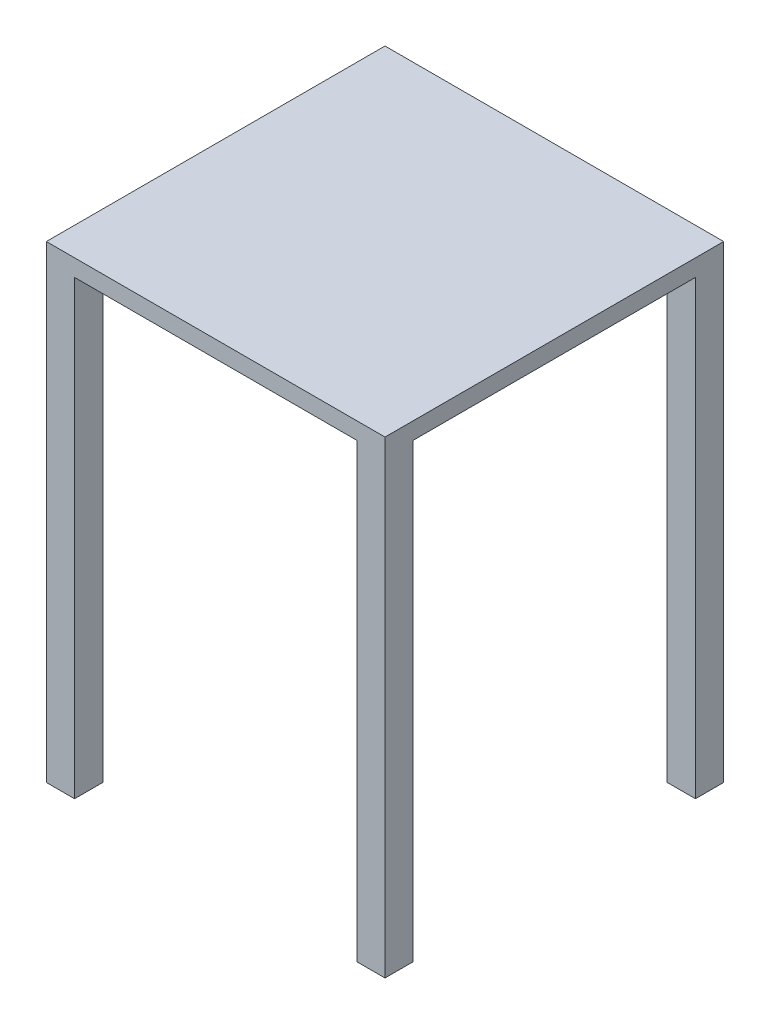
ISO-10303-21;
HEADER;
FILE_DESCRIPTION(('STEP AP214'),'2;1');
FILE_NAME('part.step','',(''),(''),'','','');
FILE_SCHEMA(('AUTOMOTIVE_DESIGN { 1 0 10303 214 1 1 1 1 }'));
ENDSEC;
DATA;
#1=APPLICATION_CONTEXT('core data for automotive mechanical design processes');
#2=APPLICATION_PROTOCOL_DEFINITION('international standard','automotive_design',2000,#1);
#3=PRODUCT_CONTEXT('',#1,'mechanical');
#4=PRODUCT('Part','Part','',(#3));
#5=PRODUCT_RELATED_PRODUCT_CATEGORY('part','',(#4));
#6=PRODUCT_DEFINITION_FORMATION('','',#4);
#7=PRODUCT_DEFINITION_CONTEXT('part definition',#1,'design');
#8=PRODUCT_DEFINITION('design','',#6,#7);
#9=PRODUCT_DEFINITION_SHAPE('','',#8);
#10=(LENGTH_UNIT() NAMED_UNIT(*) SI_UNIT(.MILLI.,.METRE.));
#11=(NAMED_UNIT(*) PLANE_ANGLE_UNIT() SI_UNIT($,.RADIAN.));
#12=(NAMED_UNIT(*) SI_UNIT($,.STERADIAN.) SOLID_ANGLE_UNIT());
#13=UNCERTAINTY_MEASURE_WITH_UNIT(LENGTH_MEASURE(1.E-05),#10,'distance_accuracy_value','');
#14=(GEOMETRIC_REPRESENTATION_CONTEXT(3) GLOBAL_UNCERTAINTY_ASSIGNED_CONTEXT((#13)) GLOBAL_UNIT_ASSIGNED_CONTEXT((#10,
#11,#12)) REPRESENTATION_CONTEXT('',''));
#15=CARTESIAN_POINT('',(0.,0.,0.));
#16=DIRECTION('',(0.,0.,1.));
#17=DIRECTION('',(1.,0.,0.));
#18=AXIS2_PLACEMENT_3D('',#15,#16,#17);
#19=CARTESIAN_POINT('',(0.,0.,0.));
#20=DIRECTION('',(0.,1.,0.));
#21=DIRECTION('',(0.,0.,1.));
#22=AXIS2_PLACEMENT_3D('',#19,#20,#21);
#23=PLANE('',#22);
#24=DIRECTION('',(0.,0.,1.));
#25=VECTOR('',#24,1.);
#26=CARTESIAN_POINT('',(-250.,0.,-300.));
#27=LINE('',#26,#25);
#28=CARTESIAN_POINT('',(-250.,0.,-300.));
#29=VERTEX_POINT('',#28);
#30=CARTESIAN_POINT('',(-250.,0.,-250.));
#31=VERTEX_POINT('',#30);
#32=EDGE_CURVE('E474',#29,#31,#27,.T.);
#33=ORIENTED_EDGE('',*,*,#32,.F.);
#34=DIRECTION('',(-1.,0.,0.));
#35=VECTOR('',#34,1.);
#36=CARTESIAN_POINT('',(300.,0.,-300.));
#37=LINE('',#36,#35);
#38=CARTESIAN_POINT('',(250.,0.,-300.));
#39=VERTEX_POINT('',#38);
#40=EDGE_CURVE('E180',#39,#29,#37,.T.);
#41=ORIENTED_EDGE('',*,*,#40,.F.);
#42=DIRECTION('',(0.,0.,-1.));
#43=VECTOR('',#42,1.);
#44=CARTESIAN_POINT('',(250.,0.,-300.));
#45=LINE('',#44,#43);
#46=CARTESIAN_POINT('',(250.,0.,-250.));
#47=VERTEX_POINT('',#46);
#48=EDGE_CURVE('E186',#47,#39,#45,.T.);
#49=ORIENTED_EDGE('',*,*,#48,.F.);
#50=DIRECTION('',(-1.,0.,0.));
#51=VECTOR('',#50,1.);
#52=CARTESIAN_POINT('',(300.,0.,-250.));
#53=LINE('',#52,#51);
#54=CARTESIAN_POINT('',(300.,0.,-250.));
#55=VERTEX_POINT('',#54);
#56=EDGE_CURVE('E182',#55,#47,#53,.T.);
#57=ORIENTED_EDGE('',*,*,#56,.F.);
#58=DIRECTION('',(0.,0.,-1.));
#59=VECTOR('',#58,1.);
#60=CARTESIAN_POINT('',(300.,0.,300.));
#61=LINE('',#60,#59);
#62=CARTESIAN_POINT('',(300.,0.,250.));
#63=VERTEX_POINT('',#62);
#64=EDGE_CURVE('E301',#63,#55,#61,.T.);
#65=ORIENTED_EDGE('',*,*,#64,.F.);
#66=DIRECTION('',(1.,0.,0.));
#67=VECTOR('',#66,1.);
#68=CARTESIAN_POINT('',(300.,0.,250.));
#69=LINE('',#68,#67);
#70=CARTESIAN_POINT('',(250.,0.,250.));
#71=VERTEX_POINT('',#70);
#72=EDGE_CURVE('E223',#71,#63,#69,.T.);
#73=ORIENTED_EDGE('',*,*,#72,.F.);
#74=DIRECTION('',(0.,0.,-1.));
#75=VECTOR('',#74,1.);
#76=CARTESIAN_POINT('',(250.,0.,300.));
#77=LINE('',#76,#75);
#78=CARTESIAN_POINT('',(250.,0.,300.));
#79=VERTEX_POINT('',#78);
#80=EDGE_CURVE('E217',#79,#71,#77,.T.);
#81=ORIENTED_EDGE('',*,*,#80,.F.);
#82=DIRECTION('',(1.,0.,0.));
#83=VECTOR('',#82,1.);
#84=CARTESIAN_POINT('',(300.,0.,300.));
#85=LINE('',#84,#83);
#86=CARTESIAN_POINT('',(-250.,0.,300.));
#87=VERTEX_POINT('',#86);
#88=EDGE_CURVE('E297',#87,#79,#85,.T.);
#89=ORIENTED_EDGE('',*,*,#88,.F.);
#90=DIRECTION('',(0.,0.,1.));
#91=VECTOR('',#90,1.);
#92=CARTESIAN_POINT('',(-250.,0.,300.));
#93=LINE('',#92,#91);
#94=CARTESIAN_POINT('',(-250.,0.,250.));
#95=VERTEX_POINT('',#94);
#96=EDGE_CURVE('E252',#95,#87,#93,.T.);
#97=ORIENTED_EDGE('',*,*,#96,.F.);
#98=DIRECTION('',(1.,0.,0.));
#99=VECTOR('',#98,1.);
#100=CARTESIAN_POINT('',(-300.,0.,250.));
#101=LINE('',#100,#99);
#102=CARTESIAN_POINT('',(-300.,0.,250.));
#103=VERTEX_POINT('',#102);
#104=EDGE_CURVE('E246',#103,#95,#101,.T.);
#105=ORIENTED_EDGE('',*,*,#104,.F.);
#106=DIRECTION('',(0.,0.,1.));
#107=VECTOR('',#106,1.);
#108=CARTESIAN_POINT('',(-300.,0.,300.));
#109=LINE('',#108,#107);
#110=CARTESIAN_POINT('',(-300.,0.,-250.));
#111=VERTEX_POINT('',#110);
#112=EDGE_CURVE('E280',#111,#103,#109,.T.);
#113=ORIENTED_EDGE('',*,*,#112,.F.);
#114=DIRECTION('',(-1.,0.,0.));
#115=VECTOR('',#114,1.);
#116=CARTESIAN_POINT('',(-300.,0.,-250.));
#117=LINE('',#116,#115);
#118=EDGE_CURVE('E176',#31,#111,#117,.T.);
#119=ORIENTED_EDGE('',*,*,#118,.F.);
#120=EDGE_LOOP('',(#33,#41,#49,#57,#65,#73,#81,#89,#97,#105,#113,#119));
#121=FACE_BOUND('',#120,.T.);
#122=ADVANCED_FACE('F39',(#121),#23,.F.);
#123=CARTESIAN_POINT('',(-300.,30.,300.));
#124=DIRECTION('',(1.,0.,0.));
#125=DIRECTION('',(0.,0.,-1.));
#126=AXIS2_PLACEMENT_3D('',#123,#124,#125);
#127=PLANE('',#126);
#128=DIRECTION('',(0.,-1.,0.));
#129=VECTOR('',#128,1.);
#130=CARTESIAN_POINT('',(-300.,30.,-300.));
#131=LINE('',#130,#129);
#132=CARTESIAN_POINT('',(-300.,30.,-300.));
#133=VERTEX_POINT('',#132);
#134=CARTESIAN_POINT('',(-300.,-800.,-300.));
#135=VERTEX_POINT('',#134);
#136=EDGE_CURVE('E294',#133,#135,#131,.T.);
#137=ORIENTED_EDGE('',*,*,#136,.T.);
#138=DIRECTION('',(0.,0.,-1.));
#139=VECTOR('',#138,1.);
#140=CARTESIAN_POINT('',(-300.,-800.,-300.));
#141=LINE('',#140,#139);
#142=CARTESIAN_POINT('',(-300.,-800.,-250.));
#143=VERTEX_POINT('',#142);
#144=EDGE_CURVE('E173',#143,#135,#141,.T.);
#145=ORIENTED_EDGE('',*,*,#144,.F.);
#146=DIRECTION('',(0.,1.,0.));
#147=VECTOR('',#146,1.);
#148=CARTESIAN_POINT('',(-300.,-800.,-250.));
#149=LINE('',#148,#147);
#150=EDGE_CURVE('E188',#143,#111,#149,.T.);
#151=ORIENTED_EDGE('',*,*,#150,.T.);
#152=ORIENTED_EDGE('',*,*,#112,.T.);
#153=DIRECTION('',(0.,1.,0.));
#154=VECTOR('',#153,1.);
#155=CARTESIAN_POINT('',(-300.,-800.,250.));
#156=LINE('',#155,#154);
#157=CARTESIAN_POINT('',(-300.,-800.,250.));
#158=VERTEX_POINT('',#157);
#159=EDGE_CURVE('E276',#158,#103,#156,.T.);
#160=ORIENTED_EDGE('',*,*,#159,.F.);
#161=DIRECTION('',(0.,0.,-1.));
#162=VECTOR('',#161,1.);
#163=CARTESIAN_POINT('',(-300.,-800.,300.));
#164=LINE('',#163,#162);
#165=CARTESIAN_POINT('',(-300.,-800.,300.));
#166=VERTEX_POINT('',#165);
#167=EDGE_CURVE('E247',#166,#158,#164,.T.);
#168=ORIENTED_EDGE('',*,*,#167,.F.);
#169=DIRECTION('',(0.,-1.,0.));
#170=VECTOR('',#169,1.);
#171=CARTESIAN_POINT('',(-300.,30.,300.));
#172=LINE('',#171,#170);
#173=CARTESIAN_POINT('',(-300.,30.,300.));
#174=VERTEX_POINT('',#173);
#175=EDGE_CURVE('E11',#174,#166,#172,.T.);
#176=ORIENTED_EDGE('',*,*,#175,.F.);
#177=DIRECTION('',(0.,0.,1.));
#178=VECTOR('',#177,1.);
#179=CARTESIAN_POINT('',(-300.,30.,300.));
#180=LINE('',#179,#178);
#181=EDGE_CURVE('E281',#133,#174,#180,.T.);
#182=ORIENTED_EDGE('',*,*,#181,.F.);
#183=EDGE_LOOP('',(#137,#145,#151,#152,#160,#168,#176,#182));
#184=FACE_BOUND('',#183,.T.);
#185=ADVANCED_FACE('F41',(#184),#127,.F.);
#186=CARTESIAN_POINT('',(300.,30.,300.));
#187=DIRECTION('',(0.,0.,-1.));
#188=DIRECTION('',(-1.,0.,0.));
#189=AXIS2_PLACEMENT_3D('',#186,#187,#188);
#190=PLANE('',#189);
#191=ORIENTED_EDGE('',*,*,#175,.T.);
#192=DIRECTION('',(-1.,0.,0.));
#193=VECTOR('',#192,1.);
#194=CARTESIAN_POINT('',(-300.,-800.,300.));
#195=LINE('',#194,#193);
#196=CARTESIAN_POINT('',(-250.,-800.,300.));
#197=VERTEX_POINT('',#196);
#198=EDGE_CURVE('E258',#197,#166,#195,.T.);
#199=ORIENTED_EDGE('',*,*,#198,.F.);
#200=DIRECTION('',(0.,1.,0.));
#201=VECTOR('',#200,1.);
#202=CARTESIAN_POINT('',(-250.,-800.,300.));
#203=LINE('',#202,#201);
#204=EDGE_CURVE('E262',#197,#87,#203,.T.);
#205=ORIENTED_EDGE('',*,*,#204,.T.);
#206=ORIENTED_EDGE('',*,*,#88,.T.);
#207=DIRECTION('',(0.,1.,0.));
#208=VECTOR('',#207,1.);
#209=CARTESIAN_POINT('',(250.,-800.,300.));
#210=LINE('',#209,#208);
#211=CARTESIAN_POINT('',(250.,-800.,300.));
#212=VERTEX_POINT('',#211);
#213=EDGE_CURVE('E243',#212,#79,#210,.T.);
#214=ORIENTED_EDGE('',*,*,#213,.F.);
#215=DIRECTION('',(-1.,0.,0.));
#216=VECTOR('',#215,1.);
#217=CARTESIAN_POINT('',(300.,-800.,300.));
#218=LINE('',#217,#216);
#219=CARTESIAN_POINT('',(300.,-800.,300.));
#220=VERTEX_POINT('',#219);
#221=EDGE_CURVE('E218',#220,#212,#218,.T.);
#222=ORIENTED_EDGE('',*,*,#221,.F.);
#223=DIRECTION('',(0.,-1.,0.));
#224=VECTOR('',#223,1.);
#225=CARTESIAN_POINT('',(300.,30.,300.));
#226=LINE('',#225,#224);
#227=CARTESIAN_POINT('',(300.,30.,300.));
#228=VERTEX_POINT('',#227);
#229=EDGE_CURVE('E48',#228,#220,#226,.T.);
#230=ORIENTED_EDGE('',*,*,#229,.F.);
#231=DIRECTION('',(1.,0.,0.));
#232=VECTOR('',#231,1.);
#233=CARTESIAN_POINT('',(300.,30.,300.));
#234=LINE('',#233,#232);
#235=EDGE_CURVE('E285',#174,#228,#234,.T.);
#236=ORIENTED_EDGE('',*,*,#235,.F.);
#237=EDGE_LOOP('',(#191,#199,#205,#206,#214,#222,#230,#236));
#238=FACE_BOUND('',#237,.T.);
#239=ADVANCED_FACE('F321',(#238),#190,.F.);
#240=CARTESIAN_POINT('',(300.,30.,300.));
#241=DIRECTION('',(-1.,0.,0.));
#242=DIRECTION('',(0.,0.,1.));
#243=AXIS2_PLACEMENT_3D('',#240,#241,#242);
#244=PLANE('',#243);
#245=ORIENTED_EDGE('',*,*,#229,.T.);
#246=DIRECTION('',(0.,0.,1.));
#247=VECTOR('',#246,1.);
#248=CARTESIAN_POINT('',(300.,-800.,300.));
#249=LINE('',#248,#247);
#250=CARTESIAN_POINT('',(300.,-800.,250.));
#251=VERTEX_POINT('',#250);
#252=EDGE_CURVE('E229',#251,#220,#249,.T.);
#253=ORIENTED_EDGE('',*,*,#252,.F.);
#254=DIRECTION('',(0.,1.,0.));
#255=VECTOR('',#254,1.);
#256=CARTESIAN_POINT('',(300.,-800.,250.));
#257=LINE('',#256,#255);
#258=EDGE_CURVE('E63',#251,#63,#257,.T.);
#259=ORIENTED_EDGE('',*,*,#258,.T.);
#260=ORIENTED_EDGE('',*,*,#64,.T.);
#261=DIRECTION('',(0.,1.,0.));
#262=VECTOR('',#261,1.);
#263=CARTESIAN_POINT('',(300.,-800.,-250.));
#264=LINE('',#263,#262);
#265=CARTESIAN_POINT('',(300.,-800.,-250.));
#266=VERTEX_POINT('',#265);
#267=EDGE_CURVE('E214',#266,#55,#264,.T.);
#268=ORIENTED_EDGE('',*,*,#267,.F.);
#269=DIRECTION('',(0.,0.,1.));
#270=VECTOR('',#269,1.);
#271=CARTESIAN_POINT('',(300.,-800.,-300.));
#272=LINE('',#271,#270);
#273=CARTESIAN_POINT('',(300.,-800.,-300.));
#274=VERTEX_POINT('',#273);
#275=EDGE_CURVE('E192',#274,#266,#272,.T.);
#276=ORIENTED_EDGE('',*,*,#275,.F.);
#277=DIRECTION('',(0.,-1.,0.));
#278=VECTOR('',#277,1.);
#279=CARTESIAN_POINT('',(300.,30.,-300.));
#280=LINE('',#279,#278);
#281=CARTESIAN_POINT('',(300.,30.,-300.));
#282=VERTEX_POINT('',#281);
#283=EDGE_CURVE('E308',#282,#274,#280,.T.);
#284=ORIENTED_EDGE('',*,*,#283,.F.);
#285=DIRECTION('',(0.,0.,-1.));
#286=VECTOR('',#285,1.);
#287=CARTESIAN_POINT('',(300.,30.,300.));
#288=LINE('',#287,#286);
#289=EDGE_CURVE('E288',#228,#282,#288,.T.);
#290=ORIENTED_EDGE('',*,*,#289,.F.);
#291=EDGE_LOOP('',(#245,#253,#259,#260,#268,#276,#284,#290));
#292=FACE_BOUND('',#291,.T.);
#293=ADVANCED_FACE('F313',(#292),#244,.F.);
#294=CARTESIAN_POINT('',(300.,30.,-300.));
#295=DIRECTION('',(0.,0.,1.));
#296=DIRECTION('',(1.,0.,0.));
#297=AXIS2_PLACEMENT_3D('',#294,#295,#296);
#298=PLANE('',#297);
#299=ORIENTED_EDGE('',*,*,#283,.T.);
#300=DIRECTION('',(1.,0.,0.));
#301=VECTOR('',#300,1.);
#302=CARTESIAN_POINT('',(300.,-800.,-300.));
#303=LINE('',#302,#301);
#304=CARTESIAN_POINT('',(250.,-800.,-300.));
#305=VERTEX_POINT('',#304);
#306=EDGE_CURVE('E202',#305,#274,#303,.T.);
#307=ORIENTED_EDGE('',*,*,#306,.F.);
#308=DIRECTION('',(0.,1.,0.));
#309=VECTOR('',#308,1.);
#310=CARTESIAN_POINT('',(250.,-800.,-300.));
#311=LINE('',#310,#309);
#312=EDGE_CURVE('E55',#305,#39,#311,.T.);
#313=ORIENTED_EDGE('',*,*,#312,.T.);
#314=ORIENTED_EDGE('',*,*,#40,.T.);
#315=DIRECTION('',(0.,1.,0.));
#316=VECTOR('',#315,1.);
#317=CARTESIAN_POINT('',(-250.,-800.,-300.));
#318=LINE('',#317,#316);
#319=CARTESIAN_POINT('',(-250.,-800.,-300.));
#320=VERTEX_POINT('',#319);
#321=EDGE_CURVE('E159',#320,#29,#318,.T.);
#322=ORIENTED_EDGE('',*,*,#321,.F.);
#323=DIRECTION('',(1.,0.,0.));
#324=VECTOR('',#323,1.);
#325=CARTESIAN_POINT('',(-300.,-800.,-300.));
#326=LINE('',#325,#324);
#327=EDGE_CURVE('E167',#135,#320,#326,.T.);
#328=ORIENTED_EDGE('',*,*,#327,.F.);
#329=ORIENTED_EDGE('',*,*,#136,.F.);
#330=DIRECTION('',(-1.,0.,0.));
#331=VECTOR('',#330,1.);
#332=CARTESIAN_POINT('',(300.,30.,-300.));
#333=LINE('',#332,#331);
#334=EDGE_CURVE('E291',#282,#133,#333,.T.);
#335=ORIENTED_EDGE('',*,*,#334,.F.);
#336=EDGE_LOOP('',(#299,#307,#313,#314,#322,#328,#329,#335));
#337=FACE_BOUND('',#336,.T.);
#338=ADVANCED_FACE('F178',(#337),#298,.F.);
#339=CARTESIAN_POINT('',(0.,30.,0.));
#340=DIRECTION('',(0.,1.,0.));
#341=DIRECTION('',(0.,0.,1.));
#342=AXIS2_PLACEMENT_3D('',#339,#340,#341);
#343=PLANE('',#342);
#344=ORIENTED_EDGE('',*,*,#181,.T.);
#345=ORIENTED_EDGE('',*,*,#235,.T.);
#346=ORIENTED_EDGE('',*,*,#289,.T.);
#347=ORIENTED_EDGE('',*,*,#334,.T.);
#348=EDGE_LOOP('',(#344,#345,#346,#347));
#349=FACE_BOUND('',#348,.T.);
#350=ADVANCED_FACE('F350',(#349),#343,.T.);
#351=CARTESIAN_POINT('',(-300.,-800.,250.));
#352=DIRECTION('',(0.,0.,1.));
#353=DIRECTION('',(1.,0.,0.));
#354=AXIS2_PLACEMENT_3D('',#351,#352,#353);
#355=PLANE('',#354);
#356=ORIENTED_EDGE('',*,*,#104,.T.);
#357=DIRECTION('',(0.,1.,0.));
#358=VECTOR('',#357,1.);
#359=CARTESIAN_POINT('',(-250.,-800.,250.));
#360=LINE('',#359,#358);
#361=CARTESIAN_POINT('',(-250.,-800.,250.));
#362=VERTEX_POINT('',#361);
#363=EDGE_CURVE('E272',#362,#95,#360,.T.);
#364=ORIENTED_EDGE('',*,*,#363,.F.);
#365=DIRECTION('',(1.,0.,0.));
#366=VECTOR('',#365,1.);
#367=CARTESIAN_POINT('',(-300.,-800.,250.));
#368=LINE('',#367,#366);
#369=EDGE_CURVE('E251',#158,#362,#368,.T.);
#370=ORIENTED_EDGE('',*,*,#369,.F.);
#371=ORIENTED_EDGE('',*,*,#159,.T.);
#372=EDGE_LOOP('',(#356,#364,#370,#371));
#373=FACE_BOUND('',#372,.T.);
#374=ADVANCED_FACE('F375',(#373),#355,.F.);
#375=CARTESIAN_POINT('',(-250.,-800.,300.));
#376=DIRECTION('',(-1.,0.,0.));
#377=DIRECTION('',(0.,0.,1.));
#378=AXIS2_PLACEMENT_3D('',#375,#376,#377);
#379=PLANE('',#378);
#380=ORIENTED_EDGE('',*,*,#96,.T.);
#381=ORIENTED_EDGE('',*,*,#204,.F.);
#382=DIRECTION('',(0.,0.,1.));
#383=VECTOR('',#382,1.);
#384=CARTESIAN_POINT('',(-250.,-800.,300.));
#385=LINE('',#384,#383);
#386=EDGE_CURVE('E255',#362,#197,#385,.T.);
#387=ORIENTED_EDGE('',*,*,#386,.F.);
#388=ORIENTED_EDGE('',*,*,#363,.T.);
#389=EDGE_LOOP('',(#380,#381,#387,#388));
#390=FACE_BOUND('',#389,.T.);
#391=ADVANCED_FACE('F381',(#390),#379,.F.);
#392=CARTESIAN_POINT('',(0.,-800.,0.));
#393=DIRECTION('',(0.,-1.,0.));
#394=DIRECTION('',(0.,0.,-1.));
#395=AXIS2_PLACEMENT_3D('',#392,#393,#394);
#396=PLANE('',#395);
#397=ORIENTED_EDGE('',*,*,#167,.T.);
#398=ORIENTED_EDGE('',*,*,#369,.T.);
#399=ORIENTED_EDGE('',*,*,#386,.T.);
#400=ORIENTED_EDGE('',*,*,#198,.T.);
#401=EDGE_LOOP('',(#397,#398,#399,#400));
#402=FACE_BOUND('',#401,.T.);
#403=ADVANCED_FACE('F340',(#402),#396,.T.);
#404=CARTESIAN_POINT('',(250.,-800.,300.));
#405=DIRECTION('',(1.,0.,0.));
#406=DIRECTION('',(0.,0.,-1.));
#407=AXIS2_PLACEMENT_3D('',#404,#405,#406);
#408=PLANE('',#407);
#409=ORIENTED_EDGE('',*,*,#80,.T.);
#410=DIRECTION('',(0.,1.,0.));
#411=VECTOR('',#410,1.);
#412=CARTESIAN_POINT('',(250.,-800.,250.));
#413=LINE('',#412,#411);
#414=CARTESIAN_POINT('',(250.,-800.,250.));
#415=VERTEX_POINT('',#414);
#416=EDGE_CURVE('E239',#415,#71,#413,.T.);
#417=ORIENTED_EDGE('',*,*,#416,.F.);
#418=DIRECTION('',(0.,0.,-1.));
#419=VECTOR('',#418,1.);
#420=CARTESIAN_POINT('',(250.,-800.,300.));
#421=LINE('',#420,#419);
#422=EDGE_CURVE('E222',#212,#415,#421,.T.);
#423=ORIENTED_EDGE('',*,*,#422,.F.);
#424=ORIENTED_EDGE('',*,*,#213,.T.);
#425=EDGE_LOOP('',(#409,#417,#423,#424));
#426=FACE_BOUND('',#425,.T.);
#427=ADVANCED_FACE('F324',(#426),#408,.F.);
#428=CARTESIAN_POINT('',(300.,-800.,250.));
#429=DIRECTION('',(0.,0.,1.));
#430=DIRECTION('',(1.,0.,0.));
#431=AXIS2_PLACEMENT_3D('',#428,#429,#430);
#432=PLANE('',#431);
#433=ORIENTED_EDGE('',*,*,#72,.T.);
#434=ORIENTED_EDGE('',*,*,#258,.F.);
#435=DIRECTION('',(1.,0.,0.));
#436=VECTOR('',#435,1.);
#437=CARTESIAN_POINT('',(300.,-800.,250.));
#438=LINE('',#437,#436);
#439=EDGE_CURVE('E226',#415,#251,#438,.T.);
#440=ORIENTED_EDGE('',*,*,#439,.F.);
#441=ORIENTED_EDGE('',*,*,#416,.T.);
#442=EDGE_LOOP('',(#433,#434,#440,#441));
#443=FACE_BOUND('',#442,.T.);
#444=ADVANCED_FACE('F331',(#443),#432,.F.);
#445=CARTESIAN_POINT('',(0.,-800.,0.));
#446=DIRECTION('',(0.,-1.,0.));
#447=DIRECTION('',(0.,0.,-1.));
#448=AXIS2_PLACEMENT_3D('',#445,#446,#447);
#449=PLANE('',#448);
#450=ORIENTED_EDGE('',*,*,#221,.T.);
#451=ORIENTED_EDGE('',*,*,#422,.T.);
#452=ORIENTED_EDGE('',*,*,#439,.T.);
#453=ORIENTED_EDGE('',*,*,#252,.T.);
#454=EDGE_LOOP('',(#450,#451,#452,#453));
#455=FACE_BOUND('',#454,.T.);
#456=ADVANCED_FACE('F318',(#455),#449,.T.);
#457=CARTESIAN_POINT('',(300.,-800.,-250.));
#458=DIRECTION('',(0.,0.,-1.));
#459=DIRECTION('',(-1.,0.,0.));
#460=AXIS2_PLACEMENT_3D('',#457,#458,#459);
#461=PLANE('',#460);
#462=ORIENTED_EDGE('',*,*,#56,.T.);
#463=DIRECTION('',(0.,1.,0.));
#464=VECTOR('',#463,1.);
#465=CARTESIAN_POINT('',(250.,-800.,-250.));
#466=LINE('',#465,#464);
#467=CARTESIAN_POINT('',(250.,-800.,-250.));
#468=VERTEX_POINT('',#467);
#469=EDGE_CURVE('E210',#468,#47,#466,.T.);
#470=ORIENTED_EDGE('',*,*,#469,.F.);
#471=DIRECTION('',(-1.,0.,0.));
#472=VECTOR('',#471,1.);
#473=CARTESIAN_POINT('',(300.,-800.,-250.));
#474=LINE('',#473,#472);
#475=EDGE_CURVE('E196',#266,#468,#474,.T.);
#476=ORIENTED_EDGE('',*,*,#475,.F.);
#477=ORIENTED_EDGE('',*,*,#267,.T.);
#478=EDGE_LOOP('',(#462,#470,#476,#477));
#479=FACE_BOUND('',#478,.T.);
#480=ADVANCED_FACE('F338',(#479),#461,.F.);
#481=CARTESIAN_POINT('',(250.,-800.,-300.));
#482=DIRECTION('',(1.,0.,0.));
#483=DIRECTION('',(0.,0.,-1.));
#484=AXIS2_PLACEMENT_3D('',#481,#482,#483);
#485=PLANE('',#484);
#486=ORIENTED_EDGE('',*,*,#48,.T.);
#487=ORIENTED_EDGE('',*,*,#312,.F.);
#488=DIRECTION('',(0.,0.,-1.));
#489=VECTOR('',#488,1.);
#490=CARTESIAN_POINT('',(250.,-800.,-300.));
#491=LINE('',#490,#489);
#492=EDGE_CURVE('E199',#468,#305,#491,.T.);
#493=ORIENTED_EDGE('',*,*,#492,.F.);
#494=ORIENTED_EDGE('',*,*,#469,.T.);
#495=EDGE_LOOP('',(#486,#487,#493,#494));
#496=FACE_BOUND('',#495,.T.);
#497=ADVANCED_FACE('F419',(#496),#485,.F.);
#498=CARTESIAN_POINT('',(0.,-800.,0.));
#499=DIRECTION('',(0.,-1.,0.));
#500=DIRECTION('',(0.,0.,-1.));
#501=AXIS2_PLACEMENT_3D('',#498,#499,#500);
#502=PLANE('',#501);
#503=ORIENTED_EDGE('',*,*,#275,.T.);
#504=ORIENTED_EDGE('',*,*,#475,.T.);
#505=ORIENTED_EDGE('',*,*,#492,.T.);
#506=ORIENTED_EDGE('',*,*,#306,.T.);
#507=EDGE_LOOP('',(#503,#504,#505,#506));
#508=FACE_BOUND('',#507,.T.);
#509=ADVANCED_FACE('F429',(#508),#502,.T.);
#510=CARTESIAN_POINT('',(-250.,-800.,-300.));
#511=DIRECTION('',(-1.,0.,0.));
#512=DIRECTION('',(0.,0.,1.));
#513=AXIS2_PLACEMENT_3D('',#510,#511,#512);
#514=PLANE('',#513);
#515=ORIENTED_EDGE('',*,*,#32,.T.);
#516=DIRECTION('',(0.,1.,0.));
#517=VECTOR('',#516,1.);
#518=CARTESIAN_POINT('',(-250.,-800.,-250.));
#519=LINE('',#518,#517);
#520=CARTESIAN_POINT('',(-250.,-800.,-250.));
#521=VERTEX_POINT('',#520);
#522=EDGE_CURVE('E162',#521,#31,#519,.T.);
#523=ORIENTED_EDGE('',*,*,#522,.F.);
#524=DIRECTION('',(0.,0.,1.));
#525=VECTOR('',#524,1.);
#526=CARTESIAN_POINT('',(-250.,-800.,-300.));
#527=LINE('',#526,#525);
#528=EDGE_CURVE('E155',#320,#521,#527,.T.);
#529=ORIENTED_EDGE('',*,*,#528,.F.);
#530=ORIENTED_EDGE('',*,*,#321,.T.);
#531=EDGE_LOOP('',(#515,#523,#529,#530));
#532=FACE_BOUND('',#531,.T.);
#533=ADVANCED_FACE('F157',(#532),#514,.F.);
#534=CARTESIAN_POINT('',(-300.,-800.,-250.));
#535=DIRECTION('',(0.,0.,-1.));
#536=DIRECTION('',(-1.,0.,0.));
#537=AXIS2_PLACEMENT_3D('',#534,#535,#536);
#538=PLANE('',#537);
#539=ORIENTED_EDGE('',*,*,#118,.T.);
#540=ORIENTED_EDGE('',*,*,#150,.F.);
#541=DIRECTION('',(-1.,0.,0.));
#542=VECTOR('',#541,1.);
#543=CARTESIAN_POINT('',(-300.,-800.,-250.));
#544=LINE('',#543,#542);
#545=EDGE_CURVE('E166',#521,#143,#544,.T.);
#546=ORIENTED_EDGE('',*,*,#545,.F.);
#547=ORIENTED_EDGE('',*,*,#522,.T.);
#548=EDGE_LOOP('',(#539,#540,#546,#547));
#549=FACE_BOUND('',#548,.T.);
#550=ADVANCED_FACE('F448',(#549),#538,.F.);
#551=CARTESIAN_POINT('',(0.,-800.,0.));
#552=DIRECTION('',(0.,-1.,0.));
#553=DIRECTION('',(0.,0.,-1.));
#554=AXIS2_PLACEMENT_3D('',#551,#552,#553);
#555=PLANE('',#554);
#556=ORIENTED_EDGE('',*,*,#327,.T.);
#557=ORIENTED_EDGE('',*,*,#528,.T.);
#558=ORIENTED_EDGE('',*,*,#545,.T.);
#559=ORIENTED_EDGE('',*,*,#144,.T.);
#560=EDGE_LOOP('',(#556,#557,#558,#559));
#561=FACE_BOUND('',#560,.T.);
#562=ADVANCED_FACE('F171',(#561),#555,.T.);
#563=CLOSED_SHELL('',(#122,#185,#239,#293,#338,#350,#374,#391,#403,#427,#444,#456,#480,#497,
#509,#533,#550,#562));
#564=MANIFOLD_SOLID_BREP('B2',#563);
#565=ADVANCED_BREP_SHAPE_REPRESENTATION('',(#18,#564),#14);
#566=SHAPE_DEFINITION_REPRESENTATION(#9,#565);
ENDSEC;
END-ISO-10303-21;
